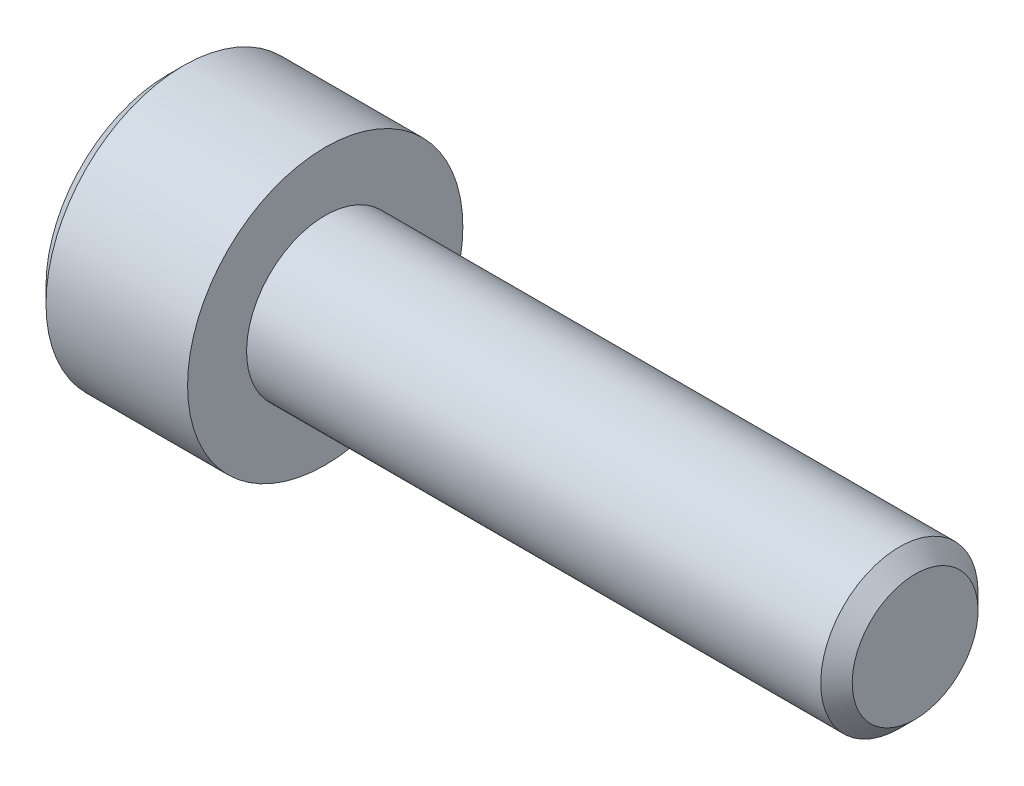
ISO-10303-21;
HEADER;
FILE_DESCRIPTION(('STEP AP214'),'2;1');
FILE_NAME('part.step','',(''),(''),'','','');
FILE_SCHEMA(('AUTOMOTIVE_DESIGN { 1 0 10303 214 1 1 1 1 }'));
ENDSEC;
DATA;
#1=APPLICATION_CONTEXT('core data for automotive mechanical design processes');
#2=APPLICATION_PROTOCOL_DEFINITION('international standard','automotive_design',2000,#1);
#3=PRODUCT_CONTEXT('',#1,'mechanical');
#4=PRODUCT('Part','Part','',(#3));
#5=PRODUCT_RELATED_PRODUCT_CATEGORY('part','',(#4));
#6=PRODUCT_DEFINITION_FORMATION('','',#4);
#7=PRODUCT_DEFINITION_CONTEXT('part definition',#1,'design');
#8=PRODUCT_DEFINITION('design','',#6,#7);
#9=PRODUCT_DEFINITION_SHAPE('','',#8);
#10=(LENGTH_UNIT() NAMED_UNIT(*) SI_UNIT(.MILLI.,.METRE.));
#11=(NAMED_UNIT(*) PLANE_ANGLE_UNIT() SI_UNIT($,.RADIAN.));
#12=(NAMED_UNIT(*) SI_UNIT($,.STERADIAN.) SOLID_ANGLE_UNIT());
#13=UNCERTAINTY_MEASURE_WITH_UNIT(LENGTH_MEASURE(1.E-05),#10,'distance_accuracy_value','');
#14=(GEOMETRIC_REPRESENTATION_CONTEXT(3) GLOBAL_UNCERTAINTY_ASSIGNED_CONTEXT((#13)) GLOBAL_UNIT_ASSIGNED_CONTEXT((#10,
#11,#12)) REPRESENTATION_CONTEXT('',''));
#15=CARTESIAN_POINT('',(0.,0.,0.));
#16=DIRECTION('',(0.,0.,1.));
#17=DIRECTION('',(1.,0.,0.));
#18=AXIS2_PLACEMENT_3D('',#15,#16,#17);
#19=CARTESIAN_POINT('',(-4.,0.,0.));
#20=DIRECTION('',(1.,0.,0.));
#21=DIRECTION('',(0.,1.,0.));
#22=AXIS2_PLACEMENT_3D('',#19,#20,#21);
#23=PLANE('',#22);
#24=CARTESIAN_POINT('',(-4.,0.,0.));
#25=DIRECTION('',(-1.,0.,0.));
#26=DIRECTION('',(0.,-1.,0.));
#27=AXIS2_PLACEMENT_3D('',#24,#25,#26);
#28=CIRCLE('',#27,3.1);
#29=CARTESIAN_POINT('',(-4.,-3.1,0.));
#30=VERTEX_POINT('',#29);
#31=EDGE_CURVE('E151',#30,#30,#28,.T.);
#32=ORIENTED_EDGE('',*,*,#31,.T.);
#33=EDGE_LOOP('',(#32));
#34=FACE_BOUND('',#33,.T.);
#35=DIRECTION('',(0.,-0.500000000000009,-0.866025403784433));
#36=VECTOR('',#35,1.);
#37=CARTESIAN_POINT('',(-4.,-0.86602540378444,1.5));
#38=LINE('',#37,#36);
#39=CARTESIAN_POINT('',(-4.,-0.86602540378444,1.5));
#40=VERTEX_POINT('',#39);
#41=CARTESIAN_POINT('',(-4.,-1.7320508075689,0.));
#42=VERTEX_POINT('',#41);
#43=EDGE_CURVE('E267',#40,#42,#38,.T.);
#44=ORIENTED_EDGE('',*,*,#43,.T.);
#45=DIRECTION('',(0.,0.500000000000009,-0.866025403784433));
#46=VECTOR('',#45,1.);
#47=CARTESIAN_POINT('',(-4.,-1.7320508075689,0.));
#48=LINE('',#47,#46);
#49=CARTESIAN_POINT('',(-4.,-0.86602540378444,-1.5));
#50=VERTEX_POINT('',#49);
#51=EDGE_CURVE('E269',#42,#50,#48,.T.);
#52=ORIENTED_EDGE('',*,*,#51,.T.);
#53=DIRECTION('',(0.,1.,0.));
#54=VECTOR('',#53,1.);
#55=CARTESIAN_POINT('',(-4.,-0.86602540378444,-1.5));
#56=LINE('',#55,#54);
#57=CARTESIAN_POINT('',(-4.,0.86602540378444,-1.5));
#58=VERTEX_POINT('',#57);
#59=EDGE_CURVE('E271',#50,#58,#56,.T.);
#60=ORIENTED_EDGE('',*,*,#59,.T.);
#61=DIRECTION('',(0.,0.500000000000009,0.866025403784433));
#62=VECTOR('',#61,1.);
#63=CARTESIAN_POINT('',(-4.,0.86602540378444,-1.5));
#64=LINE('',#63,#62);
#65=CARTESIAN_POINT('',(-4.,1.7320508075689,0.));
#66=VERTEX_POINT('',#65);
#67=EDGE_CURVE('E116',#58,#66,#64,.T.);
#68=ORIENTED_EDGE('',*,*,#67,.T.);
#69=DIRECTION('',(0.,-0.500000000000009,0.866025403784433));
#70=VECTOR('',#69,1.);
#71=CARTESIAN_POINT('',(-4.,1.7320508075689,0.));
#72=LINE('',#71,#70);
#73=CARTESIAN_POINT('',(-4.,0.86602540378444,1.5));
#74=VERTEX_POINT('',#73);
#75=EDGE_CURVE('E264',#66,#74,#72,.T.);
#76=ORIENTED_EDGE('',*,*,#75,.T.);
#77=DIRECTION('',(0.,-1.,0.));
#78=VECTOR('',#77,1.);
#79=CARTESIAN_POINT('',(-4.,0.86602540378444,1.5));
#80=LINE('',#79,#78);
#81=EDGE_CURVE('E131',#74,#40,#80,.T.);
#82=ORIENTED_EDGE('',*,*,#81,.T.);
#83=EDGE_LOOP('',(#44,#52,#60,#68,#76,#82));
#84=FACE_BOUND('',#83,.T.);
#85=ADVANCED_FACE('F32',(#34,#84),#23,.F.);
#86=CARTESIAN_POINT('',(-3.6,0.,0.));
#87=DIRECTION('',(1.,0.,0.));
#88=DIRECTION('',(0.,1.,0.));
#89=AXIS2_PLACEMENT_3D('',#86,#87,#88);
#90=CONICAL_SURFACE('',#89,3.5,0.785398163397447);
#91=ORIENTED_EDGE('',*,*,#31,.F.);
#92=EDGE_LOOP('',(#91));
#93=FACE_BOUND('',#92,.T.);
#94=CARTESIAN_POINT('',(-3.6,0.,0.));
#95=DIRECTION('',(-1.,0.,0.));
#96=DIRECTION('',(0.,-1.,0.));
#97=AXIS2_PLACEMENT_3D('',#94,#95,#96);
#98=CIRCLE('',#97,3.5);
#99=CARTESIAN_POINT('',(-3.6,-3.5,0.));
#100=VERTEX_POINT('',#99);
#101=EDGE_CURVE('E148',#100,#100,#98,.T.);
#102=ORIENTED_EDGE('',*,*,#101,.T.);
#103=EDGE_LOOP('',(#102));
#104=FACE_BOUND('',#103,.T.);
#105=ADVANCED_FACE('F171',(#93,#104),#90,.T.);
#106=CARTESIAN_POINT('',(15.,0.,0.));
#107=DIRECTION('',(-1.,0.,0.));
#108=DIRECTION('',(0.,-1.,0.));
#109=AXIS2_PLACEMENT_3D('',#106,#107,#108);
#110=CYLINDRICAL_SURFACE('',#109,3.5);
#111=ORIENTED_EDGE('',*,*,#101,.F.);
#112=EDGE_LOOP('',(#111));
#113=FACE_BOUND('',#112,.T.);
#114=CARTESIAN_POINT('',(0.,0.,0.));
#115=DIRECTION('',(-1.,0.,0.));
#116=DIRECTION('',(0.,-1.,0.));
#117=AXIS2_PLACEMENT_3D('',#114,#115,#116);
#118=CIRCLE('',#117,3.5);
#119=CARTESIAN_POINT('',(0.,-3.5,0.));
#120=VERTEX_POINT('',#119);
#121=EDGE_CURVE('E145',#120,#120,#118,.T.);
#122=ORIENTED_EDGE('',*,*,#121,.T.);
#123=EDGE_LOOP('',(#122));
#124=FACE_BOUND('',#123,.T.);
#125=ADVANCED_FACE('F176',(#113,#124),#110,.T.);
#126=CARTESIAN_POINT('',(0.,3.5,0.));
#127=DIRECTION('',(-1.,0.,0.));
#128=DIRECTION('',(0.,-1.,0.));
#129=AXIS2_PLACEMENT_3D('',#126,#127,#128);
#130=PLANE('',#129);
#131=ORIENTED_EDGE('',*,*,#121,.F.);
#132=EDGE_LOOP('',(#131));
#133=FACE_BOUND('',#132,.T.);
#134=CARTESIAN_POINT('',(0.,0.,0.));
#135=DIRECTION('',(-1.,0.,0.));
#136=DIRECTION('',(0.,-1.,0.));
#137=AXIS2_PLACEMENT_3D('',#134,#135,#136);
#138=CIRCLE('',#137,2.);
#139=CARTESIAN_POINT('',(0.,-2.,0.));
#140=VERTEX_POINT('',#139);
#141=EDGE_CURVE('E141',#140,#140,#138,.T.);
#142=ORIENTED_EDGE('',*,*,#141,.T.);
#143=EDGE_LOOP('',(#142));
#144=FACE_BOUND('',#143,.T.);
#145=ADVANCED_FACE('F183',(#133,#144),#130,.F.);
#146=CARTESIAN_POINT('',(15.,0.,0.));
#147=DIRECTION('',(-1.,0.,0.));
#148=DIRECTION('',(0.,-1.,0.));
#149=AXIS2_PLACEMENT_3D('',#146,#147,#148);
#150=CYLINDRICAL_SURFACE('',#149,2.);
#151=CARTESIAN_POINT('',(14.6,0.,0.));
#152=DIRECTION('',(-1.,0.,0.));
#153=DIRECTION('',(0.,-1.,0.));
#154=AXIS2_PLACEMENT_3D('',#151,#152,#153);
#155=CIRCLE('',#154,2.);
#156=CARTESIAN_POINT('',(14.6,-2.,0.));
#157=VERTEX_POINT('',#156);
#158=EDGE_CURVE('E40',#157,#157,#155,.T.);
#159=ORIENTED_EDGE('',*,*,#158,.T.);
#160=EDGE_LOOP('',(#159));
#161=FACE_BOUND('',#160,.T.);
#162=ORIENTED_EDGE('',*,*,#141,.F.);
#163=EDGE_LOOP('',(#162));
#164=FACE_BOUND('',#163,.T.);
#165=ADVANCED_FACE('F156',(#161,#164),#150,.T.);
#166=CARTESIAN_POINT('',(15.,2.,0.));
#167=DIRECTION('',(-1.,0.,0.));
#168=DIRECTION('',(0.,-1.,0.));
#169=AXIS2_PLACEMENT_3D('',#166,#167,#168);
#170=PLANE('',#169);
#171=CARTESIAN_POINT('',(15.,0.,0.));
#172=DIRECTION('',(-1.,0.,0.));
#173=DIRECTION('',(0.,-1.,0.));
#174=AXIS2_PLACEMENT_3D('',#171,#172,#173);
#175=CIRCLE('',#174,1.59999999999999);
#176=CARTESIAN_POINT('',(15.,-1.59999999999999,0.));
#177=VERTEX_POINT('',#176);
#178=EDGE_CURVE('E11',#177,#177,#175,.F.);
#179=ORIENTED_EDGE('',*,*,#178,.T.);
#180=EDGE_LOOP('',(#179));
#181=FACE_BOUND('',#180,.T.);
#182=ADVANCED_FACE('F160',(#181),#170,.F.);
#183=CARTESIAN_POINT('',(14.6,0.,0.));
#184=DIRECTION('',(-1.,0.,0.));
#185=DIRECTION('',(0.,-1.,0.));
#186=AXIS2_PLACEMENT_3D('',#183,#184,#185);
#187=CONICAL_SURFACE('',#186,2.,0.785398163397454);
#188=ORIENTED_EDGE('',*,*,#178,.F.);
#189=EDGE_LOOP('',(#188));
#190=FACE_BOUND('',#189,.T.);
#191=ORIENTED_EDGE('',*,*,#158,.F.);
#192=EDGE_LOOP('',(#191));
#193=FACE_BOUND('',#192,.T.);
#194=ADVANCED_FACE('F34',(#190,#193),#187,.T.);
#195=CARTESIAN_POINT('',(-2.,1.7320508075689,0.));
#196=DIRECTION('',(0.,-0.866025403784433,-0.500000000000009));
#197=DIRECTION('',(0.,0.500000000000009,-0.866025403784433));
#198=AXIS2_PLACEMENT_3D('',#195,#196,#197);
#199=PLANE('',#198);
#200=DIRECTION('',(0.,-0.500000000000009,0.866025403784433));
#201=VECTOR('',#200,1.);
#202=CARTESIAN_POINT('',(-2.,1.7320508075689,0.));
#203=LINE('',#202,#201);
#204=CARTESIAN_POINT('',(-2.,1.7320508075689,0.));
#205=VERTEX_POINT('',#204);
#206=CARTESIAN_POINT('',(-2.,1.29903810567666,0.750000000000019));
#207=VERTEX_POINT('',#206);
#208=EDGE_CURVE('E113',#205,#207,#203,.T.);
#209=ORIENTED_EDGE('',*,*,#208,.T.);
#210=CARTESIAN_POINT('',(-2.,0.86602540378444,1.5));
#211=VERTEX_POINT('',#210);
#212=EDGE_CURVE('E105',#207,#211,#203,.T.);
#213=ORIENTED_EDGE('',*,*,#212,.T.);
#214=DIRECTION('',(-1.,0.,0.));
#215=VECTOR('',#214,1.);
#216=CARTESIAN_POINT('',(-2.,0.86602540378444,1.5));
#217=LINE('',#216,#215);
#218=EDGE_CURVE('E110',#211,#74,#217,.T.);
#219=ORIENTED_EDGE('',*,*,#218,.T.);
#220=ORIENTED_EDGE('',*,*,#75,.F.);
#221=DIRECTION('',(-1.,0.,0.));
#222=VECTOR('',#221,1.);
#223=CARTESIAN_POINT('',(-2.,1.7320508075689,0.));
#224=LINE('',#223,#222);
#225=EDGE_CURVE('E248',#205,#66,#224,.T.);
#226=ORIENTED_EDGE('',*,*,#225,.F.);
#227=EDGE_LOOP('',(#209,#213,#219,#220,#226));
#228=FACE_BOUND('',#227,.T.);
#229=ADVANCED_FACE('F107',(#228),#199,.T.);
#230=CARTESIAN_POINT('',(-2.,0.86602540378444,1.5));
#231=DIRECTION('',(0.,0.,-1.));
#232=DIRECTION('',(-1.,0.,0.));
#233=AXIS2_PLACEMENT_3D('',#230,#231,#232);
#234=PLANE('',#233);
#235=DIRECTION('',(0.,-1.,0.));
#236=VECTOR('',#235,1.);
#237=CARTESIAN_POINT('',(-2.,0.86602540378444,1.5));
#238=LINE('',#237,#236);
#239=CARTESIAN_POINT('',(-2.,0.,1.5));
#240=VERTEX_POINT('',#239);
#241=EDGE_CURVE('E119',#211,#240,#238,.T.);
#242=ORIENTED_EDGE('',*,*,#241,.T.);
#243=CARTESIAN_POINT('',(-2.,-0.86602540378444,1.5));
#244=VERTEX_POINT('',#243);
#245=EDGE_CURVE('E126',#240,#244,#238,.T.);
#246=ORIENTED_EDGE('',*,*,#245,.T.);
#247=DIRECTION('',(-1.,0.,0.));
#248=VECTOR('',#247,1.);
#249=CARTESIAN_POINT('',(-2.,-0.86602540378444,1.5));
#250=LINE('',#249,#248);
#251=EDGE_CURVE('E133',#244,#40,#250,.T.);
#252=ORIENTED_EDGE('',*,*,#251,.T.);
#253=ORIENTED_EDGE('',*,*,#81,.F.);
#254=ORIENTED_EDGE('',*,*,#218,.F.);
#255=EDGE_LOOP('',(#242,#246,#252,#253,#254));
#256=FACE_BOUND('',#255,.T.);
#257=ADVANCED_FACE('F129',(#256),#234,.T.);
#258=CARTESIAN_POINT('',(-2.,-0.86602540378444,1.5));
#259=DIRECTION('',(0.,0.866025403784433,-0.500000000000009));
#260=DIRECTION('',(0.,0.500000000000009,0.866025403784433));
#261=AXIS2_PLACEMENT_3D('',#258,#259,#260);
#262=PLANE('',#261);
#263=DIRECTION('',(0.,-0.500000000000009,-0.866025403784433));
#264=VECTOR('',#263,1.);
#265=CARTESIAN_POINT('',(-2.,-0.86602540378444,1.5));
#266=LINE('',#265,#264);
#267=CARTESIAN_POINT('',(-2.,-1.29903810567666,0.750000000000019));
#268=VERTEX_POINT('',#267);
#269=EDGE_CURVE('E255',#244,#268,#266,.T.);
#270=ORIENTED_EDGE('',*,*,#269,.T.);
#271=CARTESIAN_POINT('',(-2.,-1.7320508075689,0.));
#272=VERTEX_POINT('',#271);
#273=EDGE_CURVE('E125',#268,#272,#266,.T.);
#274=ORIENTED_EDGE('',*,*,#273,.T.);
#275=DIRECTION('',(-1.,0.,0.));
#276=VECTOR('',#275,1.);
#277=CARTESIAN_POINT('',(-2.,-1.7320508075689,0.));
#278=LINE('',#277,#276);
#279=EDGE_CURVE('E137',#272,#42,#278,.T.);
#280=ORIENTED_EDGE('',*,*,#279,.T.);
#281=ORIENTED_EDGE('',*,*,#43,.F.);
#282=ORIENTED_EDGE('',*,*,#251,.F.);
#283=EDGE_LOOP('',(#270,#274,#280,#281,#282));
#284=FACE_BOUND('',#283,.T.);
#285=ADVANCED_FACE('F197',(#284),#262,.T.);
#286=CARTESIAN_POINT('',(-2.,-1.7320508075689,0.));
#287=DIRECTION('',(0.,0.866025403784433,0.500000000000009));
#288=DIRECTION('',(0.,-0.500000000000009,0.866025403784433));
#289=AXIS2_PLACEMENT_3D('',#286,#287,#288);
#290=PLANE('',#289);
#291=DIRECTION('',(0.,0.500000000000009,-0.866025403784433));
#292=VECTOR('',#291,1.);
#293=CARTESIAN_POINT('',(-2.,-1.7320508075689,0.));
#294=LINE('',#293,#292);
#295=CARTESIAN_POINT('',(-2.,-1.29903810567665,-0.750000000000014));
#296=VERTEX_POINT('',#295);
#297=EDGE_CURVE('E47',#272,#296,#294,.T.);
#298=ORIENTED_EDGE('',*,*,#297,.T.);
#299=CARTESIAN_POINT('',(-2.,-0.86602540378444,-1.5));
#300=VERTEX_POINT('',#299);
#301=EDGE_CURVE('E260',#296,#300,#294,.T.);
#302=ORIENTED_EDGE('',*,*,#301,.T.);
#303=DIRECTION('',(-1.,0.,0.));
#304=VECTOR('',#303,1.);
#305=CARTESIAN_POINT('',(-2.,-0.86602540378444,-1.5));
#306=LINE('',#305,#304);
#307=EDGE_CURVE('E276',#300,#50,#306,.T.);
#308=ORIENTED_EDGE('',*,*,#307,.T.);
#309=ORIENTED_EDGE('',*,*,#51,.F.);
#310=ORIENTED_EDGE('',*,*,#279,.F.);
#311=EDGE_LOOP('',(#298,#302,#308,#309,#310));
#312=FACE_BOUND('',#311,.T.);
#313=ADVANCED_FACE('F200',(#312),#290,.T.);
#314=CARTESIAN_POINT('',(-2.,-0.86602540378444,-1.5));
#315=DIRECTION('',(0.,0.,1.));
#316=DIRECTION('',(1.,0.,0.));
#317=AXIS2_PLACEMENT_3D('',#314,#315,#316);
#318=PLANE('',#317);
#319=DIRECTION('',(0.,1.,0.));
#320=VECTOR('',#319,1.);
#321=CARTESIAN_POINT('',(-2.,-0.86602540378444,-1.5));
#322=LINE('',#321,#320);
#323=CARTESIAN_POINT('',(-2.,0.,-1.5));
#324=VERTEX_POINT('',#323);
#325=EDGE_CURVE('E242',#300,#324,#322,.T.);
#326=ORIENTED_EDGE('',*,*,#325,.T.);
#327=CARTESIAN_POINT('',(-2.,0.86602540378444,-1.5));
#328=VERTEX_POINT('',#327);
#329=EDGE_CURVE('E235',#324,#328,#322,.T.);
#330=ORIENTED_EDGE('',*,*,#329,.T.);
#331=DIRECTION('',(-1.,0.,0.));
#332=VECTOR('',#331,1.);
#333=CARTESIAN_POINT('',(-2.,0.86602540378444,-1.5));
#334=LINE('',#333,#332);
#335=EDGE_CURVE('E247',#328,#58,#334,.T.);
#336=ORIENTED_EDGE('',*,*,#335,.T.);
#337=ORIENTED_EDGE('',*,*,#59,.F.);
#338=ORIENTED_EDGE('',*,*,#307,.F.);
#339=EDGE_LOOP('',(#326,#330,#336,#337,#338));
#340=FACE_BOUND('',#339,.T.);
#341=ADVANCED_FACE('F204',(#340),#318,.T.);
#342=CARTESIAN_POINT('',(-2.,0.86602540378444,-1.5));
#343=DIRECTION('',(0.,-0.866025403784433,0.500000000000009));
#344=DIRECTION('',(0.,-0.500000000000009,-0.866025403784433));
#345=AXIS2_PLACEMENT_3D('',#342,#343,#344);
#346=PLANE('',#345);
#347=DIRECTION('',(0.,0.500000000000009,0.866025403784433));
#348=VECTOR('',#347,1.);
#349=CARTESIAN_POINT('',(-2.,0.86602540378444,-1.5));
#350=LINE('',#349,#348);
#351=CARTESIAN_POINT('',(-2.,1.29903810567666,-0.750000000000019));
#352=VERTEX_POINT('',#351);
#353=EDGE_CURVE('E234',#328,#352,#350,.T.);
#354=ORIENTED_EDGE('',*,*,#353,.T.);
#355=EDGE_CURVE('E240',#352,#205,#350,.T.);
#356=ORIENTED_EDGE('',*,*,#355,.T.);
#357=ORIENTED_EDGE('',*,*,#225,.T.);
#358=ORIENTED_EDGE('',*,*,#67,.F.);
#359=ORIENTED_EDGE('',*,*,#335,.F.);
#360=EDGE_LOOP('',(#354,#356,#357,#358,#359));
#361=FACE_BOUND('',#360,.T.);
#362=ADVANCED_FACE('F207',(#361),#346,.T.);
#363=CARTESIAN_POINT('',(-2.,0.86602540378444,1.5));
#364=DIRECTION('',(1.,0.,0.));
#365=DIRECTION('',(0.,0.,-1.));
#366=AXIS2_PLACEMENT_3D('',#363,#364,#365);
#367=PLANE('',#366);
#368=CARTESIAN_POINT('',(-2.,0.,0.));
#369=DIRECTION('',(-1.,0.,0.));
#370=DIRECTION('',(0.,0.,1.));
#371=AXIS2_PLACEMENT_3D('',#368,#369,#370);
#372=CIRCLE('',#371,1.5);
#373=EDGE_CURVE('E231',#352,#324,#372,.T.);
#374=ORIENTED_EDGE('',*,*,#373,.F.);
#375=ORIENTED_EDGE('',*,*,#353,.F.);
#376=ORIENTED_EDGE('',*,*,#329,.F.);
#377=EDGE_LOOP('',(#374,#375,#376));
#378=FACE_BOUND('',#377,.T.);
#379=ADVANCED_FACE('F211',(#378),#367,.F.);
#380=EDGE_CURVE('E142',#207,#352,#372,.T.);
#381=ORIENTED_EDGE('',*,*,#380,.F.);
#382=ORIENTED_EDGE('',*,*,#208,.F.);
#383=ORIENTED_EDGE('',*,*,#355,.F.);
#384=EDGE_LOOP('',(#381,#382,#383));
#385=FACE_BOUND('',#384,.T.);
#386=ADVANCED_FACE('F222',(#385),#367,.F.);
#387=EDGE_CURVE('E121',#240,#207,#372,.T.);
#388=ORIENTED_EDGE('',*,*,#387,.F.);
#389=ORIENTED_EDGE('',*,*,#241,.F.);
#390=ORIENTED_EDGE('',*,*,#212,.F.);
#391=EDGE_LOOP('',(#388,#389,#390));
#392=FACE_BOUND('',#391,.T.);
#393=ADVANCED_FACE('F120',(#392),#367,.F.);
#394=EDGE_CURVE('E132',#268,#240,#372,.T.);
#395=ORIENTED_EDGE('',*,*,#394,.F.);
#396=ORIENTED_EDGE('',*,*,#269,.F.);
#397=ORIENTED_EDGE('',*,*,#245,.F.);
#398=EDGE_LOOP('',(#395,#396,#397));
#399=FACE_BOUND('',#398,.T.);
#400=ADVANCED_FACE('F219',(#399),#367,.F.);
#401=EDGE_CURVE('E135',#296,#268,#372,.T.);
#402=ORIENTED_EDGE('',*,*,#401,.F.);
#403=ORIENTED_EDGE('',*,*,#297,.F.);
#404=ORIENTED_EDGE('',*,*,#273,.F.);
#405=EDGE_LOOP('',(#402,#403,#404));
#406=FACE_BOUND('',#405,.T.);
#407=ADVANCED_FACE('F214',(#406),#367,.F.);
#408=EDGE_CURVE('E239',#324,#296,#372,.T.);
#409=ORIENTED_EDGE('',*,*,#408,.F.);
#410=ORIENTED_EDGE('',*,*,#325,.F.);
#411=ORIENTED_EDGE('',*,*,#301,.F.);
#412=EDGE_LOOP('',(#409,#410,#411));
#413=FACE_BOUND('',#412,.T.);
#414=ADVANCED_FACE('F192',(#413),#367,.F.);
#415=CARTESIAN_POINT('',(-1.5980762113533,0.,0.));
#416=DIRECTION('',(-1.,0.,0.));
#417=DIRECTION('',(0.,0.,1.));
#418=AXIS2_PLACEMENT_3D('',#415,#416,#417);
#419=CONICAL_SURFACE('',#418,0.,1.30899693899574);
#420=ORIENTED_EDGE('',*,*,#387,.T.);
#421=ORIENTED_EDGE('',*,*,#380,.T.);
#422=ORIENTED_EDGE('',*,*,#373,.T.);
#423=ORIENTED_EDGE('',*,*,#408,.T.);
#424=ORIENTED_EDGE('',*,*,#401,.T.);
#425=ORIENTED_EDGE('',*,*,#394,.T.);
#426=EDGE_LOOP('',(#420,#421,#422,#423,#424,#425));
#427=FACE_BOUND('',#426,.T.);
#428=CARTESIAN_POINT('',(-1.5980762113533,0.,0.));
#429=VERTEX_POINT('',#428);
#430=VERTEX_LOOP('',#429);
#431=FACE_BOUND('',#430,.T.);
#432=ADVANCED_FACE('F190',(#427,#431),#419,.F.);
#433=CLOSED_SHELL('',(#85,#105,#125,#145,#165,#182,#194,#229,#257,#285,#313,#341,#362,#379,#386,
#393,#400,#407,#414,#432));
#434=MANIFOLD_SOLID_BREP('B2',#433);
#435=ADVANCED_BREP_SHAPE_REPRESENTATION('',(#18,#434),#14);
#436=SHAPE_DEFINITION_REPRESENTATION(#9,#435);
ENDSEC;
END-ISO-10303-21;
